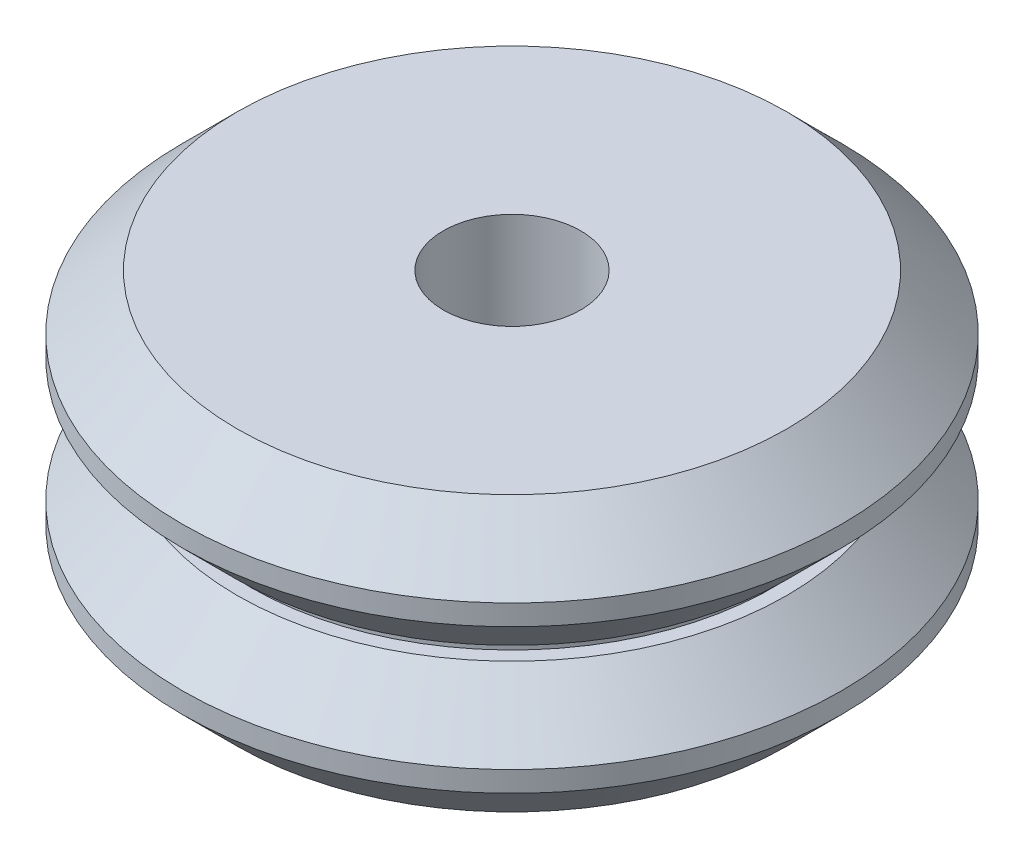
ISO-10303-21;
HEADER;
FILE_DESCRIPTION(('STEP AP214'),'2;1');
FILE_NAME('part.step','',(''),(''),'','','');
FILE_SCHEMA(('AUTOMOTIVE_DESIGN { 1 0 10303 214 1 1 1 1 }'));
ENDSEC;
DATA;
#1=APPLICATION_CONTEXT('core data for automotive mechanical design processes');
#2=APPLICATION_PROTOCOL_DEFINITION('international standard','automotive_design',2000,#1);
#3=PRODUCT_CONTEXT('',#1,'mechanical');
#4=PRODUCT('Part','Part','',(#3));
#5=PRODUCT_RELATED_PRODUCT_CATEGORY('part','',(#4));
#6=PRODUCT_DEFINITION_FORMATION('','',#4);
#7=PRODUCT_DEFINITION_CONTEXT('part definition',#1,'design');
#8=PRODUCT_DEFINITION('design','',#6,#7);
#9=PRODUCT_DEFINITION_SHAPE('','',#8);
#10=(LENGTH_UNIT() NAMED_UNIT(*) SI_UNIT(.MILLI.,.METRE.));
#11=(NAMED_UNIT(*) PLANE_ANGLE_UNIT() SI_UNIT($,.RADIAN.));
#12=(NAMED_UNIT(*) SI_UNIT($,.STERADIAN.) SOLID_ANGLE_UNIT());
#13=UNCERTAINTY_MEASURE_WITH_UNIT(LENGTH_MEASURE(1.E-05),#10,'distance_accuracy_value','');
#14=(GEOMETRIC_REPRESENTATION_CONTEXT(3) GLOBAL_UNCERTAINTY_ASSIGNED_CONTEXT((#13)) GLOBAL_UNIT_ASSIGNED_CONTEXT((#10,
#11,#12)) REPRESENTATION_CONTEXT('',''));
#15=CARTESIAN_POINT('',(0.,0.,0.));
#16=DIRECTION('',(0.,0.,1.));
#17=DIRECTION('',(1.,0.,0.));
#18=AXIS2_PLACEMENT_3D('',#15,#16,#17);
#19=CARTESIAN_POINT('',(0.,2.25,0.));
#20=DIRECTION('',(0.,1.,0.));
#21=DIRECTION('',(0.,0.,1.));
#22=AXIS2_PLACEMENT_3D('',#19,#20,#21);
#23=CONICAL_SURFACE('',#22,12.,0.785398163397448);
#24=CARTESIAN_POINT('',(0.,0.25,0.));
#25=DIRECTION('',(0.,1.,0.));
#26=DIRECTION('',(0.,0.,1.));
#27=AXIS2_PLACEMENT_3D('',#24,#25,#26);
#28=CIRCLE('',#27,10.);
#29=CARTESIAN_POINT('',(0.,0.25,10.));
#30=VERTEX_POINT('',#29);
#31=EDGE_CURVE('E80',#30,#30,#28,.T.);
#32=ORIENTED_EDGE('',*,*,#31,.T.);
#33=EDGE_LOOP('',(#32));
#34=FACE_BOUND('',#33,.T.);
#35=CARTESIAN_POINT('',(0.,2.25,0.));
#36=DIRECTION('',(0.,1.,0.));
#37=DIRECTION('',(0.,0.,1.));
#38=AXIS2_PLACEMENT_3D('',#35,#36,#37);
#39=CIRCLE('',#38,12.);
#40=CARTESIAN_POINT('',(0.,2.25,12.));
#41=VERTEX_POINT('',#40);
#42=EDGE_CURVE('E10',#41,#41,#39,.T.);
#43=ORIENTED_EDGE('',*,*,#42,.F.);
#44=EDGE_LOOP('',(#43));
#45=FACE_BOUND('',#44,.T.);
#46=ADVANCED_FACE('F37',(#34,#45),#23,.T.);
#47=CARTESIAN_POINT('',(0.,5.,0.));
#48=DIRECTION('',(0.,1.,0.));
#49=DIRECTION('',(0.,0.,1.));
#50=AXIS2_PLACEMENT_3D('',#47,#48,#49);
#51=CYLINDRICAL_SURFACE('',#50,12.);
#52=ORIENTED_EDGE('',*,*,#42,.T.);
#53=EDGE_LOOP('',(#52));
#54=FACE_BOUND('',#53,.T.);
#55=CARTESIAN_POINT('',(0.,3.,0.));
#56=DIRECTION('',(0.,1.,0.));
#57=DIRECTION('',(0.,0.,1.));
#58=AXIS2_PLACEMENT_3D('',#55,#56,#57);
#59=CIRCLE('',#58,12.);
#60=CARTESIAN_POINT('',(0.,3.,12.));
#61=VERTEX_POINT('',#60);
#62=EDGE_CURVE('E44',#61,#61,#59,.T.);
#63=ORIENTED_EDGE('',*,*,#62,.F.);
#64=EDGE_LOOP('',(#63));
#65=FACE_BOUND('',#64,.T.);
#66=ADVANCED_FACE('F111',(#54,#65),#51,.T.);
#67=CARTESIAN_POINT('',(0.,5.,0.));
#68=DIRECTION('',(0.,-1.,0.));
#69=DIRECTION('',(0.,0.,-1.));
#70=AXIS2_PLACEMENT_3D('',#67,#68,#69);
#71=CONICAL_SURFACE('',#70,10.,0.785398163397448);
#72=ORIENTED_EDGE('',*,*,#62,.T.);
#73=EDGE_LOOP('',(#72));
#74=FACE_BOUND('',#73,.T.);
#75=CARTESIAN_POINT('',(0.,5.,0.));
#76=DIRECTION('',(0.,1.,0.));
#77=DIRECTION('',(0.,0.,1.));
#78=AXIS2_PLACEMENT_3D('',#75,#76,#77);
#79=CIRCLE('',#78,10.);
#80=CARTESIAN_POINT('',(0.,5.,10.));
#81=VERTEX_POINT('',#80);
#82=EDGE_CURVE('E49',#81,#81,#79,.T.);
#83=ORIENTED_EDGE('',*,*,#82,.F.);
#84=EDGE_LOOP('',(#83));
#85=FACE_BOUND('',#84,.T.);
#86=ADVANCED_FACE('F106',(#74,#85),#71,.T.);
#87=CARTESIAN_POINT('',(0.,5.,0.));
#88=DIRECTION('',(0.,1.,0.));
#89=DIRECTION('',(0.,0.,1.));
#90=AXIS2_PLACEMENT_3D('',#87,#88,#89);
#91=PLANE('',#90);
#92=CARTESIAN_POINT('',(0.,5.,0.));
#93=DIRECTION('',(0.,1.,0.));
#94=DIRECTION('',(0.,0.,1.));
#95=AXIS2_PLACEMENT_3D('',#92,#93,#94);
#96=CIRCLE('',#95,2.5);
#97=CARTESIAN_POINT('',(0.,5.,2.5));
#98=VERTEX_POINT('',#97);
#99=EDGE_CURVE('E85',#98,#98,#96,.T.);
#100=ORIENTED_EDGE('',*,*,#99,.F.);
#101=EDGE_LOOP('',(#100));
#102=FACE_BOUND('',#101,.T.);
#103=ORIENTED_EDGE('',*,*,#82,.T.);
#104=EDGE_LOOP('',(#103));
#105=FACE_BOUND('',#104,.T.);
#106=ADVANCED_FACE('F103',(#102,#105),#91,.T.);
#107=CARTESIAN_POINT('',(0.,-5.,0.));
#108=DIRECTION('',(0.,-1.,0.));
#109=DIRECTION('',(0.,0.,-1.));
#110=AXIS2_PLACEMENT_3D('',#107,#108,#109);
#111=PLANE('',#110);
#112=CARTESIAN_POINT('',(0.,-5.,0.));
#113=DIRECTION('',(0.,1.,0.));
#114=DIRECTION('',(0.,0.,1.));
#115=AXIS2_PLACEMENT_3D('',#112,#113,#114);
#116=CIRCLE('',#115,2.5);
#117=CARTESIAN_POINT('',(0.,-5.,2.5));
#118=VERTEX_POINT('',#117);
#119=EDGE_CURVE('E84',#118,#118,#116,.T.);
#120=ORIENTED_EDGE('',*,*,#119,.T.);
#121=EDGE_LOOP('',(#120));
#122=FACE_BOUND('',#121,.T.);
#123=CARTESIAN_POINT('',(0.,-5.,0.));
#124=DIRECTION('',(0.,1.,0.));
#125=DIRECTION('',(0.,0.,1.));
#126=AXIS2_PLACEMENT_3D('',#123,#124,#125);
#127=CIRCLE('',#126,10.);
#128=CARTESIAN_POINT('',(0.,-5.,10.));
#129=VERTEX_POINT('',#128);
#130=EDGE_CURVE('E54',#129,#129,#127,.T.);
#131=ORIENTED_EDGE('',*,*,#130,.F.);
#132=EDGE_LOOP('',(#131));
#133=FACE_BOUND('',#132,.T.);
#134=ADVANCED_FACE('F93',(#122,#133),#111,.T.);
#135=CARTESIAN_POINT('',(0.,-3.,0.));
#136=DIRECTION('',(0.,1.,0.));
#137=DIRECTION('',(0.,0.,1.));
#138=AXIS2_PLACEMENT_3D('',#135,#136,#137);
#139=CONICAL_SURFACE('',#138,12.,0.785398163397448);
#140=ORIENTED_EDGE('',*,*,#130,.T.);
#141=EDGE_LOOP('',(#140));
#142=FACE_BOUND('',#141,.T.);
#143=CARTESIAN_POINT('',(0.,-3.,0.));
#144=DIRECTION('',(0.,1.,0.));
#145=DIRECTION('',(0.,0.,1.));
#146=AXIS2_PLACEMENT_3D('',#143,#144,#145);
#147=CIRCLE('',#146,12.);
#148=CARTESIAN_POINT('',(0.,-3.,12.));
#149=VERTEX_POINT('',#148);
#150=EDGE_CURVE('E60',#149,#149,#147,.T.);
#151=ORIENTED_EDGE('',*,*,#150,.F.);
#152=EDGE_LOOP('',(#151));
#153=FACE_BOUND('',#152,.T.);
#154=ADVANCED_FACE('F144',(#142,#153),#139,.T.);
#155=CARTESIAN_POINT('',(0.,5.,0.));
#156=DIRECTION('',(0.,1.,0.));
#157=DIRECTION('',(0.,0.,1.));
#158=AXIS2_PLACEMENT_3D('',#155,#156,#157);
#159=CYLINDRICAL_SURFACE('',#158,12.);
#160=ORIENTED_EDGE('',*,*,#150,.T.);
#161=EDGE_LOOP('',(#160));
#162=FACE_BOUND('',#161,.T.);
#163=CARTESIAN_POINT('',(0.,-2.25,0.));
#164=DIRECTION('',(0.,1.,0.));
#165=DIRECTION('',(0.,0.,1.));
#166=AXIS2_PLACEMENT_3D('',#163,#164,#165);
#167=CIRCLE('',#166,12.);
#168=CARTESIAN_POINT('',(0.,-2.25,12.));
#169=VERTEX_POINT('',#168);
#170=EDGE_CURVE('E64',#169,#169,#167,.T.);
#171=ORIENTED_EDGE('',*,*,#170,.F.);
#172=EDGE_LOOP('',(#171));
#173=FACE_BOUND('',#172,.T.);
#174=ADVANCED_FACE('F140',(#162,#173),#159,.T.);
#175=CARTESIAN_POINT('',(0.,-0.25,0.));
#176=DIRECTION('',(0.,-1.,0.));
#177=DIRECTION('',(0.,0.,-1.));
#178=AXIS2_PLACEMENT_3D('',#175,#176,#177);
#179=CONICAL_SURFACE('',#178,10.,0.785398163397448);
#180=ORIENTED_EDGE('',*,*,#170,.T.);
#181=EDGE_LOOP('',(#180));
#182=FACE_BOUND('',#181,.T.);
#183=CARTESIAN_POINT('',(0.,-0.25,0.));
#184=DIRECTION('',(0.,1.,0.));
#185=DIRECTION('',(0.,0.,1.));
#186=AXIS2_PLACEMENT_3D('',#183,#184,#185);
#187=CIRCLE('',#186,10.);
#188=CARTESIAN_POINT('',(0.,-0.25,10.));
#189=VERTEX_POINT('',#188);
#190=EDGE_CURVE('E68',#189,#189,#187,.T.);
#191=ORIENTED_EDGE('',*,*,#190,.F.);
#192=EDGE_LOOP('',(#191));
#193=FACE_BOUND('',#192,.T.);
#194=ADVANCED_FACE('F136',(#182,#193),#179,.T.);
#195=CARTESIAN_POINT('',(0.,-0.25,0.));
#196=DIRECTION('',(0.,1.,0.));
#197=DIRECTION('',(0.,0.,1.));
#198=AXIS2_PLACEMENT_3D('',#195,#196,#197);
#199=PLANE('',#198);
#200=ORIENTED_EDGE('',*,*,#190,.T.);
#201=EDGE_LOOP('',(#200));
#202=FACE_BOUND('',#201,.T.);
#203=CARTESIAN_POINT('',(0.,-0.25,0.));
#204=DIRECTION('',(0.,1.,0.));
#205=DIRECTION('',(0.,0.,1.));
#206=AXIS2_PLACEMENT_3D('',#203,#204,#205);
#207=CIRCLE('',#206,9.5);
#208=CARTESIAN_POINT('',(0.,-0.25,9.5));
#209=VERTEX_POINT('',#208);
#210=EDGE_CURVE('E72',#209,#209,#207,.T.);
#211=ORIENTED_EDGE('',*,*,#210,.F.);
#212=EDGE_LOOP('',(#211));
#213=FACE_BOUND('',#212,.T.);
#214=ADVANCED_FACE('F130',(#202,#213),#199,.T.);
#215=CARTESIAN_POINT('',(0.,5.,0.));
#216=DIRECTION('',(0.,1.,0.));
#217=DIRECTION('',(0.,0.,1.));
#218=AXIS2_PLACEMENT_3D('',#215,#216,#217);
#219=CYLINDRICAL_SURFACE('',#218,9.5);
#220=ORIENTED_EDGE('',*,*,#210,.T.);
#221=EDGE_LOOP('',(#220));
#222=FACE_BOUND('',#221,.T.);
#223=CARTESIAN_POINT('',(0.,0.25,0.));
#224=DIRECTION('',(0.,1.,0.));
#225=DIRECTION('',(0.,0.,1.));
#226=AXIS2_PLACEMENT_3D('',#223,#224,#225);
#227=CIRCLE('',#226,9.5);
#228=CARTESIAN_POINT('',(0.,0.25,9.5));
#229=VERTEX_POINT('',#228);
#230=EDGE_CURVE('E76',#229,#229,#227,.T.);
#231=ORIENTED_EDGE('',*,*,#230,.F.);
#232=EDGE_LOOP('',(#231));
#233=FACE_BOUND('',#232,.T.);
#234=ADVANCED_FACE('F124',(#222,#233),#219,.T.);
#235=CARTESIAN_POINT('',(0.,0.25,0.));
#236=DIRECTION('',(0.,-1.,0.));
#237=DIRECTION('',(0.,0.,-1.));
#238=AXIS2_PLACEMENT_3D('',#235,#236,#237);
#239=PLANE('',#238);
#240=ORIENTED_EDGE('',*,*,#230,.T.);
#241=EDGE_LOOP('',(#240));
#242=FACE_BOUND('',#241,.T.);
#243=ORIENTED_EDGE('',*,*,#31,.F.);
#244=EDGE_LOOP('',(#243));
#245=FACE_BOUND('',#244,.T.);
#246=ADVANCED_FACE('F99',(#242,#245),#239,.T.);
#247=CARTESIAN_POINT('',(0.,-5.,0.));
#248=DIRECTION('',(0.,1.,0.));
#249=DIRECTION('',(0.,0.,1.));
#250=AXIS2_PLACEMENT_3D('',#247,#248,#249);
#251=CYLINDRICAL_SURFACE('',#250,2.5);
#252=ORIENTED_EDGE('',*,*,#119,.F.);
#253=EDGE_LOOP('',(#252));
#254=FACE_BOUND('',#253,.T.);
#255=ORIENTED_EDGE('',*,*,#99,.T.);
#256=EDGE_LOOP('',(#255));
#257=FACE_BOUND('',#256,.T.);
#258=ADVANCED_FACE('F96',(#254,#257),#251,.F.);
#259=CLOSED_SHELL('',(#46,#66,#86,#106,#134,#154,#174,#194,#214,#234,#246,#258));
#260=MANIFOLD_SOLID_BREP('B2',#259);
#261=ADVANCED_BREP_SHAPE_REPRESENTATION('',(#18,#260),#14);
#262=SHAPE_DEFINITION_REPRESENTATION(#9,#261);
ENDSEC;
END-ISO-10303-21;
